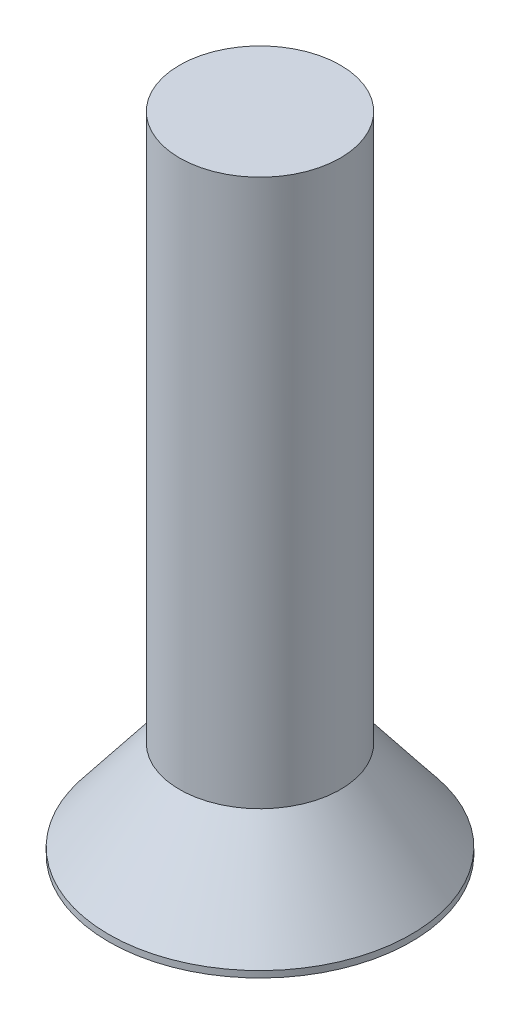
ISO-10303-21;
HEADER;
FILE_DESCRIPTION(('STEP AP214'),'2;1');
FILE_NAME('part.step','',(''),(''),'','','');
FILE_SCHEMA(('AUTOMOTIVE_DESIGN { 1 0 10303 214 1 1 1 1 }'));
ENDSEC;
DATA;
#1=APPLICATION_CONTEXT('core data for automotive mechanical design processes');
#2=APPLICATION_PROTOCOL_DEFINITION('international standard','automotive_design',2000,#1);
#3=PRODUCT_CONTEXT('',#1,'mechanical');
#4=PRODUCT('Part','Part','',(#3));
#5=PRODUCT_RELATED_PRODUCT_CATEGORY('part','',(#4));
#6=PRODUCT_DEFINITION_FORMATION('','',#4);
#7=PRODUCT_DEFINITION_CONTEXT('part definition',#1,'design');
#8=PRODUCT_DEFINITION('design','',#6,#7);
#9=PRODUCT_DEFINITION_SHAPE('','',#8);
#10=(LENGTH_UNIT() NAMED_UNIT(*) SI_UNIT(.MILLI.,.METRE.));
#11=(NAMED_UNIT(*) PLANE_ANGLE_UNIT() SI_UNIT($,.RADIAN.));
#12=(NAMED_UNIT(*) SI_UNIT($,.STERADIAN.) SOLID_ANGLE_UNIT());
#13=UNCERTAINTY_MEASURE_WITH_UNIT(LENGTH_MEASURE(1.E-05),#10,'distance_accuracy_value','');
#14=(GEOMETRIC_REPRESENTATION_CONTEXT(3) GLOBAL_UNCERTAINTY_ASSIGNED_CONTEXT((#13)) GLOBAL_UNIT_ASSIGNED_CONTEXT((#10,
#11,#12)) REPRESENTATION_CONTEXT('',''));
#15=CARTESIAN_POINT('',(0.,0.,0.));
#16=DIRECTION('',(0.,0.,1.));
#17=DIRECTION('',(1.,0.,0.));
#18=AXIS2_PLACEMENT_3D('',#15,#16,#17);
#19=CARTESIAN_POINT('',(0.,10.,0.));
#20=DIRECTION('',(0.,-1.,0.));
#21=DIRECTION('',(0.,0.,-1.));
#22=AXIS2_PLACEMENT_3D('',#19,#20,#21);
#23=CYLINDRICAL_SURFACE('',#22,1.25);
#24=CARTESIAN_POINT('',(0.,10.,0.));
#25=DIRECTION('',(0.,1.,0.));
#26=DIRECTION('',(0.,0.,1.));
#27=AXIS2_PLACEMENT_3D('',#24,#25,#26);
#28=CIRCLE('',#27,1.25);
#29=CARTESIAN_POINT('',(0.,10.,1.25));
#30=VERTEX_POINT('',#29);
#31=EDGE_CURVE('E47',#30,#30,#28,.T.);
#32=ORIENTED_EDGE('',*,*,#31,.F.);
#33=EDGE_LOOP('',(#32));
#34=FACE_BOUND('',#33,.T.);
#35=CARTESIAN_POINT('',(0.,1.5,0.));
#36=DIRECTION('',(0.,-1.,0.));
#37=DIRECTION('',(0.,0.,-1.));
#38=AXIS2_PLACEMENT_3D('',#35,#36,#37);
#39=CIRCLE('',#38,1.25);
#40=CARTESIAN_POINT('',(0.,1.5,-1.25));
#41=VERTEX_POINT('',#40);
#42=EDGE_CURVE('E11',#41,#41,#39,.T.);
#43=ORIENTED_EDGE('',*,*,#42,.F.);
#44=EDGE_LOOP('',(#43));
#45=FACE_BOUND('',#44,.T.);
#46=ADVANCED_FACE('F39',(#34,#45),#23,.T.);
#47=CARTESIAN_POINT('',(0.,10.,0.));
#48=DIRECTION('',(0.,1.,0.));
#49=DIRECTION('',(0.,0.,1.));
#50=AXIS2_PLACEMENT_3D('',#47,#48,#49);
#51=PLANE('',#50);
#52=ORIENTED_EDGE('',*,*,#31,.T.);
#53=EDGE_LOOP('',(#52));
#54=FACE_BOUND('',#53,.T.);
#55=ADVANCED_FACE('F251',(#54),#51,.T.);
#56=CARTESIAN_POINT('',(0.,1.5,0.));
#57=DIRECTION('',(0.,-1.,0.));
#58=DIRECTION('',(0.,0.,-1.));
#59=AXIS2_PLACEMENT_3D('',#56,#57,#58);
#60=CONICAL_SURFACE('',#59,1.25,0.66596923737911);
#61=CARTESIAN_POINT('',(0.,0.1,0.));
#62=DIRECTION('',(0.,-1.,0.));
#63=DIRECTION('',(0.,0.,-1.));
#64=AXIS2_PLACEMENT_3D('',#61,#62,#63);
#65=CIRCLE('',#64,2.35);
#66=CARTESIAN_POINT('',(0.,0.1,-2.35));
#67=VERTEX_POINT('',#66);
#68=EDGE_CURVE('E244',#67,#67,#65,.T.);
#69=ORIENTED_EDGE('',*,*,#68,.F.);
#70=EDGE_LOOP('',(#69));
#71=FACE_BOUND('',#70,.T.);
#72=ORIENTED_EDGE('',*,*,#42,.T.);
#73=EDGE_LOOP('',(#72));
#74=FACE_BOUND('',#73,.T.);
#75=ADVANCED_FACE('F257',(#71,#74),#60,.T.);
#76=CARTESIAN_POINT('',(0.,-0.5,0.));
#77=DIRECTION('',(0.,-1.,0.));
#78=DIRECTION('',(0.,0.,-1.));
#79=AXIS2_PLACEMENT_3D('',#76,#77,#78);
#80=CYLINDRICAL_SURFACE('',#79,2.35);
#81=CARTESIAN_POINT('',(0.,0.,0.));
#82=DIRECTION('',(0.,-1.,0.));
#83=DIRECTION('',(0.,0.,-1.));
#84=AXIS2_PLACEMENT_3D('',#81,#82,#83);
#85=CIRCLE('',#84,2.35);
#86=CARTESIAN_POINT('',(0.,0.,-2.35));
#87=VERTEX_POINT('',#86);
#88=EDGE_CURVE('E213',#87,#87,#85,.T.);
#89=ORIENTED_EDGE('',*,*,#88,.F.);
#90=EDGE_LOOP('',(#89));
#91=FACE_BOUND('',#90,.T.);
#92=ORIENTED_EDGE('',*,*,#68,.T.);
#93=EDGE_LOOP('',(#92));
#94=FACE_BOUND('',#93,.T.);
#95=ADVANCED_FACE('F259',(#91,#94),#80,.T.);
#96=CARTESIAN_POINT('',(0.,0.,0.));
#97=DIRECTION('',(0.,1.,0.));
#98=DIRECTION('',(0.,0.,1.));
#99=AXIS2_PLACEMENT_3D('',#96,#97,#98);
#100=PLANE('',#99);
#101=DIRECTION('',(1.,0.,0.));
#102=VECTOR('',#101,1.);
#103=CARTESIAN_POINT('',(-1.5,0.,-0.25));
#104=LINE('',#103,#102);
#105=CARTESIAN_POINT('',(-1.5,0.,-0.25));
#106=VERTEX_POINT('',#105);
#107=CARTESIAN_POINT('',(-0.25,0.,-0.25));
#108=VERTEX_POINT('',#107);
#109=EDGE_CURVE('E170',#106,#108,#104,.T.);
#110=ORIENTED_EDGE('',*,*,#109,.F.);
#111=DIRECTION('',(0.,0.,-1.));
#112=VECTOR('',#111,1.);
#113=CARTESIAN_POINT('',(-1.5,0.,0.25));
#114=LINE('',#113,#112);
#115=CARTESIAN_POINT('',(-1.5,0.,0.25));
#116=VERTEX_POINT('',#115);
#117=EDGE_CURVE('E54',#116,#106,#114,.T.);
#118=ORIENTED_EDGE('',*,*,#117,.F.);
#119=DIRECTION('',(-1.,0.,0.));
#120=VECTOR('',#119,1.);
#121=CARTESIAN_POINT('',(-0.25,0.,0.25));
#122=LINE('',#121,#120);
#123=CARTESIAN_POINT('',(-0.25,0.,0.25));
#124=VERTEX_POINT('',#123);
#125=EDGE_CURVE('E207',#124,#116,#122,.T.);
#126=ORIENTED_EDGE('',*,*,#125,.F.);
#127=DIRECTION('',(0.,0.,-1.));
#128=VECTOR('',#127,1.);
#129=CARTESIAN_POINT('',(-0.25,0.,1.5));
#130=LINE('',#129,#128);
#131=CARTESIAN_POINT('',(-0.25,0.,1.5));
#132=VERTEX_POINT('',#131);
#133=EDGE_CURVE('E204',#132,#124,#130,.T.);
#134=ORIENTED_EDGE('',*,*,#133,.F.);
#135=DIRECTION('',(-1.,0.,0.));
#136=VECTOR('',#135,1.);
#137=CARTESIAN_POINT('',(0.25,0.,1.5));
#138=LINE('',#137,#136);
#139=CARTESIAN_POINT('',(0.25,0.,1.5));
#140=VERTEX_POINT('',#139);
#141=EDGE_CURVE('E138',#140,#132,#138,.T.);
#142=ORIENTED_EDGE('',*,*,#141,.F.);
#143=DIRECTION('',(0.,0.,1.));
#144=VECTOR('',#143,1.);
#145=CARTESIAN_POINT('',(0.25,0.,0.25));
#146=LINE('',#145,#144);
#147=CARTESIAN_POINT('',(0.25,0.,0.25));
#148=VERTEX_POINT('',#147);
#149=EDGE_CURVE('E198',#148,#140,#146,.T.);
#150=ORIENTED_EDGE('',*,*,#149,.F.);
#151=DIRECTION('',(-1.,0.,0.));
#152=VECTOR('',#151,1.);
#153=CARTESIAN_POINT('',(1.5,0.,0.25));
#154=LINE('',#153,#152);
#155=CARTESIAN_POINT('',(1.5,0.,0.25));
#156=VERTEX_POINT('',#155);
#157=EDGE_CURVE('E194',#156,#148,#154,.T.);
#158=ORIENTED_EDGE('',*,*,#157,.F.);
#159=DIRECTION('',(0.,0.,1.));
#160=VECTOR('',#159,1.);
#161=CARTESIAN_POINT('',(1.5,0.,-0.25));
#162=LINE('',#161,#160);
#163=CARTESIAN_POINT('',(1.5,0.,-0.25));
#164=VERTEX_POINT('',#163);
#165=EDGE_CURVE('E190',#164,#156,#162,.T.);
#166=ORIENTED_EDGE('',*,*,#165,.F.);
#167=DIRECTION('',(1.,0.,0.));
#168=VECTOR('',#167,1.);
#169=CARTESIAN_POINT('',(0.25,0.,-0.25));
#170=LINE('',#169,#168);
#171=CARTESIAN_POINT('',(0.25,0.,-0.25));
#172=VERTEX_POINT('',#171);
#173=EDGE_CURVE('E186',#172,#164,#170,.T.);
#174=ORIENTED_EDGE('',*,*,#173,.F.);
#175=DIRECTION('',(0.,0.,1.));
#176=VECTOR('',#175,1.);
#177=CARTESIAN_POINT('',(0.25,0.,-1.5));
#178=LINE('',#177,#176);
#179=CARTESIAN_POINT('',(0.25,0.,-1.5));
#180=VERTEX_POINT('',#179);
#181=EDGE_CURVE('E182',#180,#172,#178,.T.);
#182=ORIENTED_EDGE('',*,*,#181,.F.);
#183=DIRECTION('',(1.,0.,0.));
#184=VECTOR('',#183,1.);
#185=CARTESIAN_POINT('',(-0.25,0.,-1.5));
#186=LINE('',#185,#184);
#187=CARTESIAN_POINT('',(-0.25,0.,-1.5));
#188=VERTEX_POINT('',#187);
#189=EDGE_CURVE('E178',#188,#180,#186,.T.);
#190=ORIENTED_EDGE('',*,*,#189,.F.);
#191=DIRECTION('',(0.,0.,-1.));
#192=VECTOR('',#191,1.);
#193=CARTESIAN_POINT('',(-0.25,0.,-0.25));
#194=LINE('',#193,#192);
#195=EDGE_CURVE('E174',#108,#188,#194,.T.);
#196=ORIENTED_EDGE('',*,*,#195,.F.);
#197=EDGE_LOOP('',(#110,#118,#126,#134,#142,#150,#158,#166,#174,#182,#190,#196));
#198=FACE_BOUND('',#197,.T.);
#199=ORIENTED_EDGE('',*,*,#88,.T.);
#200=EDGE_LOOP('',(#199));
#201=FACE_BOUND('',#200,.T.);
#202=ADVANCED_FACE('F266',(#198,#201),#100,.F.);
#203=CARTESIAN_POINT('',(-1.5,0.5,0.25));
#204=DIRECTION('',(-1.,0.,0.));
#205=DIRECTION('',(0.,0.,1.));
#206=AXIS2_PLACEMENT_3D('',#203,#204,#205);
#207=PLANE('',#206);
#208=ORIENTED_EDGE('',*,*,#117,.T.);
#209=DIRECTION('',(0.,-1.,0.));
#210=VECTOR('',#209,1.);
#211=CARTESIAN_POINT('',(-1.5,0.5,-0.25));
#212=LINE('',#211,#210);
#213=CARTESIAN_POINT('',(-1.5,0.5,-0.25));
#214=VERTEX_POINT('',#213);
#215=EDGE_CURVE('E102',#214,#106,#212,.T.);
#216=ORIENTED_EDGE('',*,*,#215,.F.);
#217=DIRECTION('',(0.,0.,-1.));
#218=VECTOR('',#217,1.);
#219=CARTESIAN_POINT('',(-1.5,0.5,0.25));
#220=LINE('',#219,#218);
#221=CARTESIAN_POINT('',(-1.5,0.5,0.25));
#222=VERTEX_POINT('',#221);
#223=EDGE_CURVE('E210',#222,#214,#220,.T.);
#224=ORIENTED_EDGE('',*,*,#223,.F.);
#225=DIRECTION('',(0.,-1.,0.));
#226=VECTOR('',#225,1.);
#227=CARTESIAN_POINT('',(-1.5,0.5,0.25));
#228=LINE('',#227,#226);
#229=EDGE_CURVE('E62',#222,#116,#228,.T.);
#230=ORIENTED_EDGE('',*,*,#229,.T.);
#231=EDGE_LOOP('',(#208,#216,#224,#230));
#232=FACE_BOUND('',#231,.T.);
#233=ADVANCED_FACE('F273',(#232),#207,.F.);
#234=CARTESIAN_POINT('',(-0.25,0.5,0.25));
#235=DIRECTION('',(0.,0.,1.));
#236=DIRECTION('',(1.,0.,0.));
#237=AXIS2_PLACEMENT_3D('',#234,#235,#236);
#238=PLANE('',#237);
#239=ORIENTED_EDGE('',*,*,#125,.T.);
#240=ORIENTED_EDGE('',*,*,#229,.F.);
#241=DIRECTION('',(-1.,0.,0.));
#242=VECTOR('',#241,1.);
#243=CARTESIAN_POINT('',(-0.25,0.5,0.25));
#244=LINE('',#243,#242);
#245=CARTESIAN_POINT('',(-0.25,0.5,0.25));
#246=VERTEX_POINT('',#245);
#247=EDGE_CURVE('E152',#246,#222,#244,.T.);
#248=ORIENTED_EDGE('',*,*,#247,.F.);
#249=DIRECTION('',(0.,-1.,0.));
#250=VECTOR('',#249,1.);
#251=CARTESIAN_POINT('',(-0.25,0.5,0.25));
#252=LINE('',#251,#250);
#253=EDGE_CURVE('E143',#246,#124,#252,.T.);
#254=ORIENTED_EDGE('',*,*,#253,.T.);
#255=EDGE_LOOP('',(#239,#240,#248,#254));
#256=FACE_BOUND('',#255,.T.);
#257=ADVANCED_FACE('F278',(#256),#238,.F.);
#258=CARTESIAN_POINT('',(-0.25,0.5,1.5));
#259=DIRECTION('',(-1.,0.,0.));
#260=DIRECTION('',(0.,0.,1.));
#261=AXIS2_PLACEMENT_3D('',#258,#259,#260);
#262=PLANE('',#261);
#263=ORIENTED_EDGE('',*,*,#133,.T.);
#264=ORIENTED_EDGE('',*,*,#253,.F.);
#265=DIRECTION('',(0.,0.,-1.));
#266=VECTOR('',#265,1.);
#267=CARTESIAN_POINT('',(-0.25,0.5,1.5));
#268=LINE('',#267,#266);
#269=CARTESIAN_POINT('',(-0.25,0.5,1.5));
#270=VERTEX_POINT('',#269);
#271=EDGE_CURVE('E147',#270,#246,#268,.T.);
#272=ORIENTED_EDGE('',*,*,#271,.F.);
#273=DIRECTION('',(0.,-1.,0.));
#274=VECTOR('',#273,1.);
#275=CARTESIAN_POINT('',(-0.25,0.5,1.5));
#276=LINE('',#275,#274);
#277=EDGE_CURVE('E131',#270,#132,#276,.T.);
#278=ORIENTED_EDGE('',*,*,#277,.T.);
#279=EDGE_LOOP('',(#263,#264,#272,#278));
#280=FACE_BOUND('',#279,.T.);
#281=ADVANCED_FACE('F148',(#280),#262,.F.);
#282=CARTESIAN_POINT('',(0.25,0.5,1.5));
#283=DIRECTION('',(0.,0.,1.));
#284=DIRECTION('',(1.,0.,0.));
#285=AXIS2_PLACEMENT_3D('',#282,#283,#284);
#286=PLANE('',#285);
#287=ORIENTED_EDGE('',*,*,#141,.T.);
#288=ORIENTED_EDGE('',*,*,#277,.F.);
#289=DIRECTION('',(-1.,0.,0.));
#290=VECTOR('',#289,1.);
#291=CARTESIAN_POINT('',(0.25,0.5,1.5));
#292=LINE('',#291,#290);
#293=CARTESIAN_POINT('',(0.25,0.5,1.5));
#294=VERTEX_POINT('',#293);
#295=EDGE_CURVE('E135',#294,#270,#292,.T.);
#296=ORIENTED_EDGE('',*,*,#295,.F.);
#297=DIRECTION('',(0.,-1.,0.));
#298=VECTOR('',#297,1.);
#299=CARTESIAN_POINT('',(0.25,0.5,1.5));
#300=LINE('',#299,#298);
#301=EDGE_CURVE('E144',#294,#140,#300,.T.);
#302=ORIENTED_EDGE('',*,*,#301,.T.);
#303=EDGE_LOOP('',(#287,#288,#296,#302));
#304=FACE_BOUND('',#303,.T.);
#305=ADVANCED_FACE('F133',(#304),#286,.F.);
#306=CARTESIAN_POINT('',(0.25,0.5,0.25));
#307=DIRECTION('',(1.,0.,0.));
#308=DIRECTION('',(0.,0.,-1.));
#309=AXIS2_PLACEMENT_3D('',#306,#307,#308);
#310=PLANE('',#309);
#311=ORIENTED_EDGE('',*,*,#149,.T.);
#312=ORIENTED_EDGE('',*,*,#301,.F.);
#313=DIRECTION('',(0.,0.,1.));
#314=VECTOR('',#313,1.);
#315=CARTESIAN_POINT('',(0.25,0.5,0.25));
#316=LINE('',#315,#314);
#317=CARTESIAN_POINT('',(0.25,0.5,0.25));
#318=VERTEX_POINT('',#317);
#319=EDGE_CURVE('E158',#318,#294,#316,.T.);
#320=ORIENTED_EDGE('',*,*,#319,.F.);
#321=DIRECTION('',(0.,-1.,0.));
#322=VECTOR('',#321,1.);
#323=CARTESIAN_POINT('',(0.25,0.5,0.25));
#324=LINE('',#323,#322);
#325=EDGE_CURVE('E218',#318,#148,#324,.T.);
#326=ORIENTED_EDGE('',*,*,#325,.T.);
#327=EDGE_LOOP('',(#311,#312,#320,#326));
#328=FACE_BOUND('',#327,.T.);
#329=ADVANCED_FACE('F323',(#328),#310,.F.);
#330=CARTESIAN_POINT('',(1.5,0.5,0.25));
#331=DIRECTION('',(0.,0.,1.));
#332=DIRECTION('',(1.,0.,0.));
#333=AXIS2_PLACEMENT_3D('',#330,#331,#332);
#334=PLANE('',#333);
#335=ORIENTED_EDGE('',*,*,#157,.T.);
#336=ORIENTED_EDGE('',*,*,#325,.F.);
#337=DIRECTION('',(-1.,0.,0.));
#338=VECTOR('',#337,1.);
#339=CARTESIAN_POINT('',(1.5,0.5,0.25));
#340=LINE('',#339,#338);
#341=CARTESIAN_POINT('',(1.5,0.5,0.25));
#342=VERTEX_POINT('',#341);
#343=EDGE_CURVE('E162',#342,#318,#340,.T.);
#344=ORIENTED_EDGE('',*,*,#343,.F.);
#345=DIRECTION('',(0.,-1.,0.));
#346=VECTOR('',#345,1.);
#347=CARTESIAN_POINT('',(1.5,0.5,0.25));
#348=LINE('',#347,#346);
#349=EDGE_CURVE('E221',#342,#156,#348,.T.);
#350=ORIENTED_EDGE('',*,*,#349,.T.);
#351=EDGE_LOOP('',(#335,#336,#344,#350));
#352=FACE_BOUND('',#351,.T.);
#353=ADVANCED_FACE('F319',(#352),#334,.F.);
#354=CARTESIAN_POINT('',(1.5,0.5,-0.25));
#355=DIRECTION('',(1.,0.,0.));
#356=DIRECTION('',(0.,0.,-1.));
#357=AXIS2_PLACEMENT_3D('',#354,#355,#356);
#358=PLANE('',#357);
#359=ORIENTED_EDGE('',*,*,#165,.T.);
#360=ORIENTED_EDGE('',*,*,#349,.F.);
#361=DIRECTION('',(0.,0.,1.));
#362=VECTOR('',#361,1.);
#363=CARTESIAN_POINT('',(1.5,0.5,-0.25));
#364=LINE('',#363,#362);
#365=CARTESIAN_POINT('',(1.5,0.5,-0.25));
#366=VERTEX_POINT('',#365);
#367=EDGE_CURVE('E312',#366,#342,#364,.T.);
#368=ORIENTED_EDGE('',*,*,#367,.F.);
#369=DIRECTION('',(0.,-1.,0.));
#370=VECTOR('',#369,1.);
#371=CARTESIAN_POINT('',(1.5,0.5,-0.25));
#372=LINE('',#371,#370);
#373=EDGE_CURVE('E224',#366,#164,#372,.T.);
#374=ORIENTED_EDGE('',*,*,#373,.T.);
#375=EDGE_LOOP('',(#359,#360,#368,#374));
#376=FACE_BOUND('',#375,.T.);
#377=ADVANCED_FACE('F338',(#376),#358,.F.);
#378=CARTESIAN_POINT('',(0.25,0.5,-0.25));
#379=DIRECTION('',(0.,0.,-1.));
#380=DIRECTION('',(-1.,0.,0.));
#381=AXIS2_PLACEMENT_3D('',#378,#379,#380);
#382=PLANE('',#381);
#383=ORIENTED_EDGE('',*,*,#173,.T.);
#384=ORIENTED_EDGE('',*,*,#373,.F.);
#385=DIRECTION('',(1.,0.,0.));
#386=VECTOR('',#385,1.);
#387=CARTESIAN_POINT('',(0.25,0.5,-0.25));
#388=LINE('',#387,#386);
#389=CARTESIAN_POINT('',(0.25,0.5,-0.25));
#390=VERTEX_POINT('',#389);
#391=EDGE_CURVE('E308',#390,#366,#388,.T.);
#392=ORIENTED_EDGE('',*,*,#391,.F.);
#393=DIRECTION('',(0.,-1.,0.));
#394=VECTOR('',#393,1.);
#395=CARTESIAN_POINT('',(0.25,0.5,-0.25));
#396=LINE('',#395,#394);
#397=EDGE_CURVE('E227',#390,#172,#396,.T.);
#398=ORIENTED_EDGE('',*,*,#397,.T.);
#399=EDGE_LOOP('',(#383,#384,#392,#398));
#400=FACE_BOUND('',#399,.T.);
#401=ADVANCED_FACE('F341',(#400),#382,.F.);
#402=CARTESIAN_POINT('',(0.25,0.5,-1.5));
#403=DIRECTION('',(1.,0.,0.));
#404=DIRECTION('',(0.,0.,-1.));
#405=AXIS2_PLACEMENT_3D('',#402,#403,#404);
#406=PLANE('',#405);
#407=ORIENTED_EDGE('',*,*,#181,.T.);
#408=ORIENTED_EDGE('',*,*,#397,.F.);
#409=DIRECTION('',(0.,0.,1.));
#410=VECTOR('',#409,1.);
#411=CARTESIAN_POINT('',(0.25,0.5,-1.5));
#412=LINE('',#411,#410);
#413=CARTESIAN_POINT('',(0.25,0.5,-1.5));
#414=VERTEX_POINT('',#413);
#415=EDGE_CURVE('E304',#414,#390,#412,.T.);
#416=ORIENTED_EDGE('',*,*,#415,.F.);
#417=DIRECTION('',(0.,-1.,0.));
#418=VECTOR('',#417,1.);
#419=CARTESIAN_POINT('',(0.25,0.5,-1.5));
#420=LINE('',#419,#418);
#421=EDGE_CURVE('E230',#414,#180,#420,.T.);
#422=ORIENTED_EDGE('',*,*,#421,.T.);
#423=EDGE_LOOP('',(#407,#408,#416,#422));
#424=FACE_BOUND('',#423,.T.);
#425=ADVANCED_FACE('F345',(#424),#406,.F.);
#426=CARTESIAN_POINT('',(-0.25,0.5,-1.5));
#427=DIRECTION('',(0.,0.,-1.));
#428=DIRECTION('',(-1.,0.,0.));
#429=AXIS2_PLACEMENT_3D('',#426,#427,#428);
#430=PLANE('',#429);
#431=ORIENTED_EDGE('',*,*,#189,.T.);
#432=ORIENTED_EDGE('',*,*,#421,.F.);
#433=DIRECTION('',(1.,0.,0.));
#434=VECTOR('',#433,1.);
#435=CARTESIAN_POINT('',(-0.25,0.5,-1.5));
#436=LINE('',#435,#434);
#437=CARTESIAN_POINT('',(-0.25,0.5,-1.5));
#438=VERTEX_POINT('',#437);
#439=EDGE_CURVE('E300',#438,#414,#436,.T.);
#440=ORIENTED_EDGE('',*,*,#439,.F.);
#441=DIRECTION('',(0.,-1.,0.));
#442=VECTOR('',#441,1.);
#443=CARTESIAN_POINT('',(-0.25,0.5,-1.5));
#444=LINE('',#443,#442);
#445=EDGE_CURVE('E233',#438,#188,#444,.T.);
#446=ORIENTED_EDGE('',*,*,#445,.T.);
#447=EDGE_LOOP('',(#431,#432,#440,#446));
#448=FACE_BOUND('',#447,.T.);
#449=ADVANCED_FACE('F349',(#448),#430,.F.);
#450=CARTESIAN_POINT('',(-0.25,0.5,-0.25));
#451=DIRECTION('',(-1.,0.,0.));
#452=DIRECTION('',(0.,0.,1.));
#453=AXIS2_PLACEMENT_3D('',#450,#451,#452);
#454=PLANE('',#453);
#455=ORIENTED_EDGE('',*,*,#195,.T.);
#456=ORIENTED_EDGE('',*,*,#445,.F.);
#457=DIRECTION('',(0.,0.,-1.));
#458=VECTOR('',#457,1.);
#459=CARTESIAN_POINT('',(-0.25,0.5,-0.25));
#460=LINE('',#459,#458);
#461=CARTESIAN_POINT('',(-0.25,0.5,-0.25));
#462=VERTEX_POINT('',#461);
#463=EDGE_CURVE('E293',#462,#438,#460,.T.);
#464=ORIENTED_EDGE('',*,*,#463,.F.);
#465=DIRECTION('',(0.,-1.,0.));
#466=VECTOR('',#465,1.);
#467=CARTESIAN_POINT('',(-0.25,0.5,-0.25));
#468=LINE('',#467,#466);
#469=EDGE_CURVE('E236',#462,#108,#468,.T.);
#470=ORIENTED_EDGE('',*,*,#469,.T.);
#471=EDGE_LOOP('',(#455,#456,#464,#470));
#472=FACE_BOUND('',#471,.T.);
#473=ADVANCED_FACE('F353',(#472),#454,.F.);
#474=CARTESIAN_POINT('',(-1.5,0.5,-0.25));
#475=DIRECTION('',(0.,0.,-1.));
#476=DIRECTION('',(-1.,0.,0.));
#477=AXIS2_PLACEMENT_3D('',#474,#475,#476);
#478=PLANE('',#477);
#479=ORIENTED_EDGE('',*,*,#109,.T.);
#480=ORIENTED_EDGE('',*,*,#469,.F.);
#481=DIRECTION('',(1.,0.,0.));
#482=VECTOR('',#481,1.);
#483=CARTESIAN_POINT('',(-1.5,0.5,-0.25));
#484=LINE('',#483,#482);
#485=EDGE_CURVE('E290',#214,#462,#484,.T.);
#486=ORIENTED_EDGE('',*,*,#485,.F.);
#487=ORIENTED_EDGE('',*,*,#215,.T.);
#488=EDGE_LOOP('',(#479,#480,#486,#487));
#489=FACE_BOUND('',#488,.T.);
#490=ADVANCED_FACE('F287',(#489),#478,.F.);
#491=CARTESIAN_POINT('',(0.,0.5,0.));
#492=DIRECTION('',(0.,-1.,0.));
#493=DIRECTION('',(0.,0.,-1.));
#494=AXIS2_PLACEMENT_3D('',#491,#492,#493);
#495=PLANE('',#494);
#496=ORIENTED_EDGE('',*,*,#223,.T.);
#497=ORIENTED_EDGE('',*,*,#485,.T.);
#498=ORIENTED_EDGE('',*,*,#463,.T.);
#499=ORIENTED_EDGE('',*,*,#439,.T.);
#500=ORIENTED_EDGE('',*,*,#415,.T.);
#501=ORIENTED_EDGE('',*,*,#391,.T.);
#502=ORIENTED_EDGE('',*,*,#367,.T.);
#503=ORIENTED_EDGE('',*,*,#343,.T.);
#504=ORIENTED_EDGE('',*,*,#319,.T.);
#505=ORIENTED_EDGE('',*,*,#295,.T.);
#506=ORIENTED_EDGE('',*,*,#271,.T.);
#507=ORIENTED_EDGE('',*,*,#247,.T.);
#508=EDGE_LOOP('',(#496,#497,#498,#499,#500,#501,#502,#503,#504,#505,#506,#507));
#509=FACE_BOUND('',#508,.T.);
#510=ADVANCED_FACE('F155',(#509),#495,.T.);
#511=CLOSED_SHELL('',(#46,#55,#75,#95,#202,#233,#257,#281,#305,#329,#353,#377,#401,#425,#449,
#473,#490,#510));
#512=MANIFOLD_SOLID_BREP('B2',#511);
#513=ADVANCED_BREP_SHAPE_REPRESENTATION('',(#18,#512),#14);
#514=SHAPE_DEFINITION_REPRESENTATION(#9,#513);
ENDSEC;
END-ISO-10303-21;
